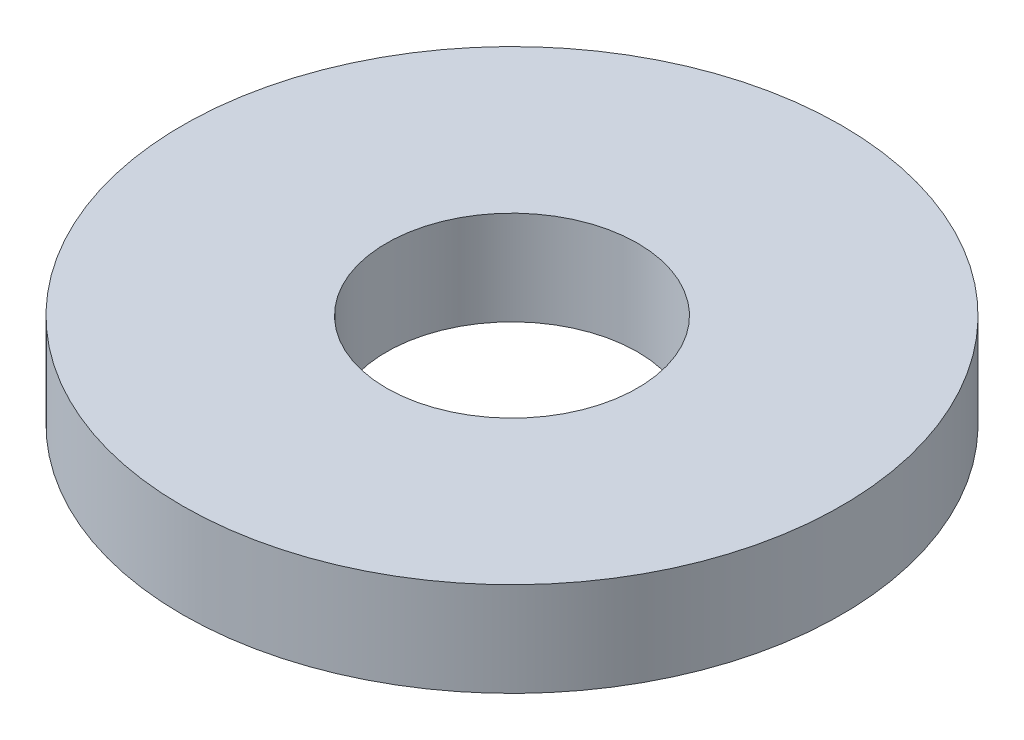
ISO-10303-21;
HEADER;
FILE_DESCRIPTION(('STEP AP214'),'2;1');
FILE_NAME('part.step','',(''),(''),'','','');
FILE_SCHEMA(('AUTOMOTIVE_DESIGN { 1 0 10303 214 1 1 1 1 }'));
ENDSEC;
DATA;
#1=APPLICATION_CONTEXT('core data for automotive mechanical design processes');
#2=APPLICATION_PROTOCOL_DEFINITION('international standard','automotive_design',2000,#1);
#3=PRODUCT_CONTEXT('',#1,'mechanical');
#4=PRODUCT('Part','Part','',(#3));
#5=PRODUCT_RELATED_PRODUCT_CATEGORY('part','',(#4));
#6=PRODUCT_DEFINITION_FORMATION('','',#4);
#7=PRODUCT_DEFINITION_CONTEXT('part definition',#1,'design');
#8=PRODUCT_DEFINITION('design','',#6,#7);
#9=PRODUCT_DEFINITION_SHAPE('','',#8);
#10=(LENGTH_UNIT() NAMED_UNIT(*) SI_UNIT(.MILLI.,.METRE.));
#11=(NAMED_UNIT(*) PLANE_ANGLE_UNIT() SI_UNIT($,.RADIAN.));
#12=(NAMED_UNIT(*) SI_UNIT($,.STERADIAN.) SOLID_ANGLE_UNIT());
#13=UNCERTAINTY_MEASURE_WITH_UNIT(LENGTH_MEASURE(1.E-05),#10,'distance_accuracy_value','');
#14=(GEOMETRIC_REPRESENTATION_CONTEXT(3) GLOBAL_UNCERTAINTY_ASSIGNED_CONTEXT((#13)) GLOBAL_UNIT_ASSIGNED_CONTEXT((#10,
#11,#12)) REPRESENTATION_CONTEXT('',''));
#15=CARTESIAN_POINT('',(0.,0.,0.));
#16=DIRECTION('',(0.,0.,1.));
#17=DIRECTION('',(1.,0.,0.));
#18=AXIS2_PLACEMENT_3D('',#15,#16,#17);
#19=CARTESIAN_POINT('',(0.,6.,0.));
#20=DIRECTION('',(0.,1.,0.));
#21=DIRECTION('',(0.,0.,1.));
#22=AXIS2_PLACEMENT_3D('',#19,#20,#21);
#23=PLANE('',#22);
#24=CARTESIAN_POINT('',(0.,6.,0.));
#25=DIRECTION('',(0.,1.,0.));
#26=DIRECTION('',(0.,0.,1.));
#27=AXIS2_PLACEMENT_3D('',#24,#25,#26);
#28=CIRCLE('',#27,42.);
#29=CARTESIAN_POINT('',(0.,6.,42.));
#30=VERTEX_POINT('',#29);
#31=EDGE_CURVE('E10',#30,#30,#28,.T.);
#32=ORIENTED_EDGE('',*,*,#31,.T.);
#33=EDGE_LOOP('',(#32));
#34=FACE_BOUND('',#33,.T.);
#35=CARTESIAN_POINT('',(0.,6.,0.));
#36=DIRECTION('',(0.,1.,0.));
#37=DIRECTION('',(0.,0.,1.));
#38=AXIS2_PLACEMENT_3D('',#35,#36,#37);
#39=CIRCLE('',#38,16.);
#40=CARTESIAN_POINT('',(0.,6.,16.));
#41=VERTEX_POINT('',#40);
#42=EDGE_CURVE('E41',#41,#41,#39,.T.);
#43=ORIENTED_EDGE('',*,*,#42,.F.);
#44=EDGE_LOOP('',(#43));
#45=FACE_BOUND('',#44,.T.);
#46=ADVANCED_FACE('F30',(#34,#45),#23,.T.);
#47=CARTESIAN_POINT('',(0.,-6.,0.));
#48=DIRECTION('',(0.,1.,0.));
#49=DIRECTION('',(0.,0.,1.));
#50=AXIS2_PLACEMENT_3D('',#47,#48,#49);
#51=PLANE('',#50);
#52=CARTESIAN_POINT('',(0.,-6.,0.));
#53=DIRECTION('',(0.,1.,0.));
#54=DIRECTION('',(0.,0.,1.));
#55=AXIS2_PLACEMENT_3D('',#52,#53,#54);
#56=CIRCLE('',#55,42.);
#57=CARTESIAN_POINT('',(0.,-6.,42.));
#58=VERTEX_POINT('',#57);
#59=EDGE_CURVE('E34',#58,#58,#56,.T.);
#60=ORIENTED_EDGE('',*,*,#59,.F.);
#61=EDGE_LOOP('',(#60));
#62=FACE_BOUND('',#61,.T.);
#63=CARTESIAN_POINT('',(0.,-6.,0.));
#64=DIRECTION('',(0.,1.,0.));
#65=DIRECTION('',(0.,0.,1.));
#66=AXIS2_PLACEMENT_3D('',#63,#64,#65);
#67=CIRCLE('',#66,16.);
#68=CARTESIAN_POINT('',(0.,-6.,16.));
#69=VERTEX_POINT('',#68);
#70=EDGE_CURVE('E43',#69,#69,#67,.T.);
#71=ORIENTED_EDGE('',*,*,#70,.T.);
#72=EDGE_LOOP('',(#71));
#73=FACE_BOUND('',#72,.T.);
#74=ADVANCED_FACE('F53',(#62,#73),#51,.F.);
#75=CARTESIAN_POINT('',(0.,6.,0.));
#76=DIRECTION('',(0.,-1.,0.));
#77=DIRECTION('',(0.,0.,-1.));
#78=AXIS2_PLACEMENT_3D('',#75,#76,#77);
#79=CYLINDRICAL_SURFACE('',#78,42.);
#80=ORIENTED_EDGE('',*,*,#31,.F.);
#81=EDGE_LOOP('',(#80));
#82=FACE_BOUND('',#81,.T.);
#83=ORIENTED_EDGE('',*,*,#59,.T.);
#84=EDGE_LOOP('',(#83));
#85=FACE_BOUND('',#84,.T.);
#86=ADVANCED_FACE('F32',(#82,#85),#79,.T.);
#87=CARTESIAN_POINT('',(0.,6.,0.));
#88=DIRECTION('',(0.,-1.,0.));
#89=DIRECTION('',(0.,0.,-1.));
#90=AXIS2_PLACEMENT_3D('',#87,#88,#89);
#91=CYLINDRICAL_SURFACE('',#90,16.);
#92=ORIENTED_EDGE('',*,*,#42,.T.);
#93=EDGE_LOOP('',(#92));
#94=FACE_BOUND('',#93,.T.);
#95=ORIENTED_EDGE('',*,*,#70,.F.);
#96=EDGE_LOOP('',(#95));
#97=FACE_BOUND('',#96,.T.);
#98=ADVANCED_FACE('F49',(#94,#97),#91,.F.);
#99=CLOSED_SHELL('',(#46,#74,#86,#98));
#100=MANIFOLD_SOLID_BREP('B2',#99);
#101=ADVANCED_BREP_SHAPE_REPRESENTATION('',(#18,#100),#14);
#102=SHAPE_DEFINITION_REPRESENTATION(#9,#101);
ENDSEC;
END-ISO-10303-21;
